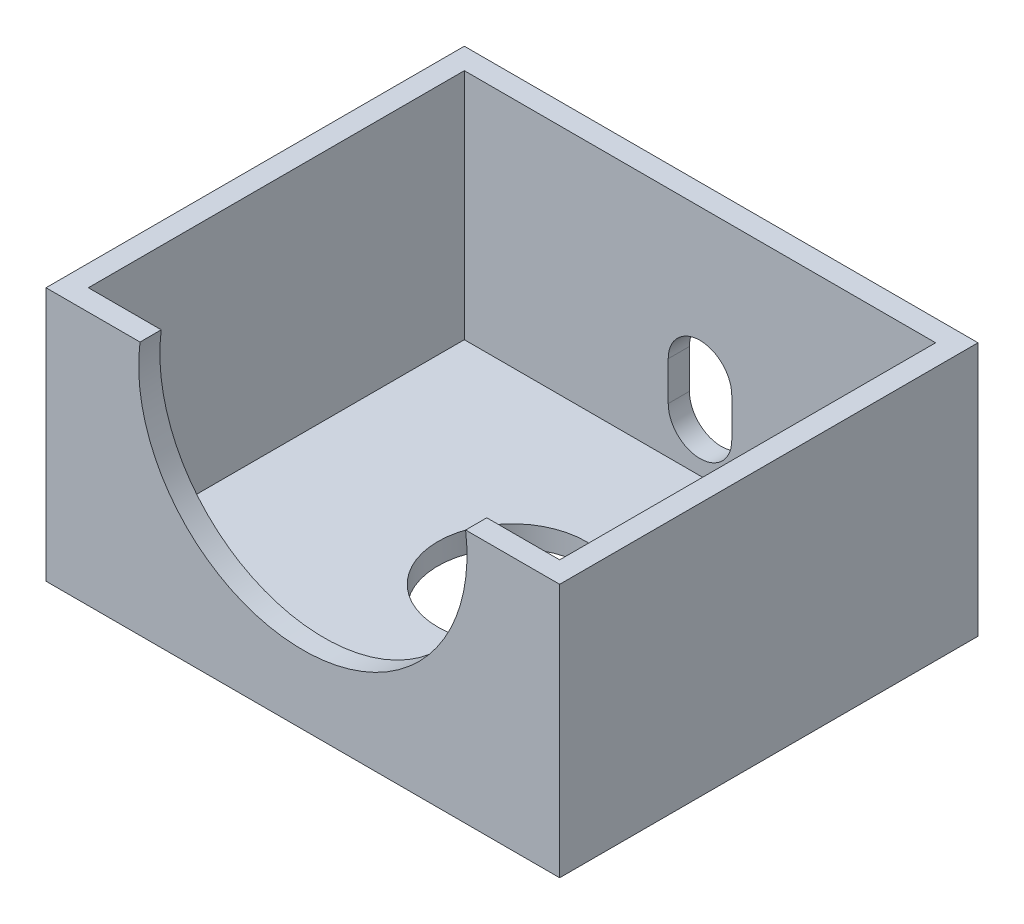
ISO-10303-21;
HEADER;
FILE_DESCRIPTION(('STEP AP214'),'2;1');
FILE_NAME('part.step','',(''),(''),'','','');
FILE_SCHEMA(('AUTOMOTIVE_DESIGN { 1 0 10303 214 1 1 1 1 }'));
ENDSEC;
DATA;
#1=APPLICATION_CONTEXT('core data for automotive mechanical design processes');
#2=APPLICATION_PROTOCOL_DEFINITION('international standard','automotive_design',2000,#1);
#3=PRODUCT_CONTEXT('',#1,'mechanical');
#4=PRODUCT('Part','Part','',(#3));
#5=PRODUCT_RELATED_PRODUCT_CATEGORY('part','',(#4));
#6=PRODUCT_DEFINITION_FORMATION('','',#4);
#7=PRODUCT_DEFINITION_CONTEXT('part definition',#1,'design');
#8=PRODUCT_DEFINITION('design','',#6,#7);
#9=PRODUCT_DEFINITION_SHAPE('','',#8);
#10=(LENGTH_UNIT() NAMED_UNIT(*) SI_UNIT(.MILLI.,.METRE.));
#11=(NAMED_UNIT(*) PLANE_ANGLE_UNIT() SI_UNIT($,.RADIAN.));
#12=(NAMED_UNIT(*) SI_UNIT($,.STERADIAN.) SOLID_ANGLE_UNIT());
#13=UNCERTAINTY_MEASURE_WITH_UNIT(LENGTH_MEASURE(1.E-05),#10,'distance_accuracy_value','');
#14=(GEOMETRIC_REPRESENTATION_CONTEXT(3) GLOBAL_UNCERTAINTY_ASSIGNED_CONTEXT((#13)) GLOBAL_UNIT_ASSIGNED_CONTEXT((#10,
#11,#12)) REPRESENTATION_CONTEXT('',''));
#15=CARTESIAN_POINT('',(0.,0.,0.));
#16=DIRECTION('',(0.,0.,1.));
#17=DIRECTION('',(1.,0.,0.));
#18=AXIS2_PLACEMENT_3D('',#15,#16,#17);
#19=CARTESIAN_POINT('',(24.25,2.,-19.75));
#20=DIRECTION('',(-1.,0.,0.));
#21=DIRECTION('',(0.,0.,1.));
#22=AXIS2_PLACEMENT_3D('',#19,#20,#21);
#23=PLANE('',#22);
#24=DIRECTION('',(0.,0.,-1.));
#25=VECTOR('',#24,1.);
#26=CARTESIAN_POINT('',(24.25,0.,-19.75));
#27=LINE('',#26,#25);
#28=CARTESIAN_POINT('',(24.25,0.,19.75));
#29=VERTEX_POINT('',#28);
#30=CARTESIAN_POINT('',(24.25,0.,-19.75));
#31=VERTEX_POINT('',#30);
#32=EDGE_CURVE('E248',#29,#31,#27,.T.);
#33=ORIENTED_EDGE('',*,*,#32,.T.);
#34=DIRECTION('',(0.,-1.,0.));
#35=VECTOR('',#34,1.);
#36=CARTESIAN_POINT('',(24.25,2.,-19.75));
#37=LINE('',#36,#35);
#38=CARTESIAN_POINT('',(24.25,24.,-19.75));
#39=VERTEX_POINT('',#38);
#40=EDGE_CURVE('E273',#39,#31,#37,.T.);
#41=ORIENTED_EDGE('',*,*,#40,.F.);
#42=DIRECTION('',(0.,0.,-1.));
#43=VECTOR('',#42,1.);
#44=CARTESIAN_POINT('',(24.25,24.,19.75));
#45=LINE('',#44,#43);
#46=CARTESIAN_POINT('',(24.25,24.,19.75));
#47=VERTEX_POINT('',#46);
#48=EDGE_CURVE('E236',#47,#39,#45,.T.);
#49=ORIENTED_EDGE('',*,*,#48,.F.);
#50=DIRECTION('',(0.,-1.,0.));
#51=VECTOR('',#50,1.);
#52=CARTESIAN_POINT('',(24.25,2.,19.75));
#53=LINE('',#52,#51);
#54=EDGE_CURVE('E261',#47,#29,#53,.T.);
#55=ORIENTED_EDGE('',*,*,#54,.T.);
#56=EDGE_LOOP('',(#33,#41,#49,#55));
#57=FACE_BOUND('',#56,.T.);
#58=ADVANCED_FACE('F43',(#57),#23,.F.);
#59=CARTESIAN_POINT('',(-24.25,2.,-19.75));
#60=DIRECTION('',(0.,0.,1.));
#61=DIRECTION('',(1.,0.,0.));
#62=AXIS2_PLACEMENT_3D('',#59,#60,#61);
#63=PLANE('',#62);
#64=DIRECTION('',(0.,-1.,0.));
#65=VECTOR('',#64,1.);
#66=CARTESIAN_POINT('',(3.,10.0708768884514,-19.75));
#67=LINE('',#66,#65);
#68=CARTESIAN_POINT('',(3.,10.0708768884514,-19.75));
#69=VERTEX_POINT('',#68);
#70=CARTESIAN_POINT('',(3.,6.40363295362596,-19.75));
#71=VERTEX_POINT('',#70);
#72=EDGE_CURVE('E157',#69,#71,#67,.T.);
#73=ORIENTED_EDGE('',*,*,#72,.F.);
#74=CARTESIAN_POINT('',(0.,10.0708768884514,-19.75));
#75=DIRECTION('',(0.,0.,-1.));
#76=DIRECTION('',(-1.,0.,0.));
#77=AXIS2_PLACEMENT_3D('',#74,#75,#76);
#78=CIRCLE('',#77,3.);
#79=CARTESIAN_POINT('',(-3.,10.0708768884514,-19.75));
#80=VERTEX_POINT('',#79);
#81=EDGE_CURVE('E59',#80,#69,#78,.T.);
#82=ORIENTED_EDGE('',*,*,#81,.F.);
#83=DIRECTION('',(0.,1.,0.));
#84=VECTOR('',#83,1.);
#85=CARTESIAN_POINT('',(-3.,10.0708768884514,-19.75));
#86=LINE('',#85,#84);
#87=CARTESIAN_POINT('',(-3.,6.40363295362596,-19.75));
#88=VERTEX_POINT('',#87);
#89=EDGE_CURVE('E165',#88,#80,#86,.T.);
#90=ORIENTED_EDGE('',*,*,#89,.F.);
#91=CARTESIAN_POINT('',(0.,6.40363295362596,-19.75));
#92=DIRECTION('',(0.,0.,-1.));
#93=DIRECTION('',(-1.,0.,0.));
#94=AXIS2_PLACEMENT_3D('',#91,#92,#93);
#95=CIRCLE('',#94,3.);
#96=EDGE_CURVE('E147',#71,#88,#95,.T.);
#97=ORIENTED_EDGE('',*,*,#96,.F.);
#98=EDGE_LOOP('',(#73,#82,#90,#97));
#99=FACE_BOUND('',#98,.T.);
#100=DIRECTION('',(-1.,0.,0.));
#101=VECTOR('',#100,1.);
#102=CARTESIAN_POINT('',(-24.25,0.,-19.75));
#103=LINE('',#102,#101);
#104=CARTESIAN_POINT('',(-24.25,0.,-19.75));
#105=VERTEX_POINT('',#104);
#106=EDGE_CURVE('E252',#31,#105,#103,.T.);
#107=ORIENTED_EDGE('',*,*,#106,.T.);
#108=DIRECTION('',(0.,-1.,0.));
#109=VECTOR('',#108,1.);
#110=CARTESIAN_POINT('',(-24.25,2.,-19.75));
#111=LINE('',#110,#109);
#112=CARTESIAN_POINT('',(-24.25,24.,-19.75));
#113=VERTEX_POINT('',#112);
#114=EDGE_CURVE('E269',#113,#105,#111,.T.);
#115=ORIENTED_EDGE('',*,*,#114,.F.);
#116=DIRECTION('',(-1.,0.,0.));
#117=VECTOR('',#116,1.);
#118=CARTESIAN_POINT('',(24.25,24.,-19.75));
#119=LINE('',#118,#117);
#120=EDGE_CURVE('E240',#39,#113,#119,.T.);
#121=ORIENTED_EDGE('',*,*,#120,.F.);
#122=ORIENTED_EDGE('',*,*,#40,.T.);
#123=EDGE_LOOP('',(#107,#115,#121,#122));
#124=FACE_BOUND('',#123,.T.);
#125=ADVANCED_FACE('F162',(#99,#124),#63,.F.);
#126=CARTESIAN_POINT('',(-24.25,2.,-19.75));
#127=DIRECTION('',(1.,0.,0.));
#128=DIRECTION('',(0.,0.,-1.));
#129=AXIS2_PLACEMENT_3D('',#126,#127,#128);
#130=PLANE('',#129);
#131=DIRECTION('',(0.,0.,1.));
#132=VECTOR('',#131,1.);
#133=CARTESIAN_POINT('',(-24.25,0.,-19.75));
#134=LINE('',#133,#132);
#135=CARTESIAN_POINT('',(-24.25,0.,19.75));
#136=VERTEX_POINT('',#135);
#137=EDGE_CURVE('E255',#105,#136,#134,.T.);
#138=ORIENTED_EDGE('',*,*,#137,.T.);
#139=DIRECTION('',(0.,-1.,0.));
#140=VECTOR('',#139,1.);
#141=CARTESIAN_POINT('',(-24.25,2.,19.75));
#142=LINE('',#141,#140);
#143=CARTESIAN_POINT('',(-24.25,24.,19.75));
#144=VERTEX_POINT('',#143);
#145=EDGE_CURVE('E265',#144,#136,#142,.T.);
#146=ORIENTED_EDGE('',*,*,#145,.F.);
#147=DIRECTION('',(0.,0.,1.));
#148=VECTOR('',#147,1.);
#149=CARTESIAN_POINT('',(-24.25,24.,-19.75));
#150=LINE('',#149,#148);
#151=EDGE_CURVE('E244',#113,#144,#150,.T.);
#152=ORIENTED_EDGE('',*,*,#151,.F.);
#153=ORIENTED_EDGE('',*,*,#114,.T.);
#154=EDGE_LOOP('',(#138,#146,#152,#153));
#155=FACE_BOUND('',#154,.T.);
#156=ADVANCED_FACE('F324',(#155),#130,.F.);
#157=CARTESIAN_POINT('',(-24.25,2.,19.75));
#158=DIRECTION('',(0.,0.,-1.));
#159=DIRECTION('',(-1.,0.,0.));
#160=AXIS2_PLACEMENT_3D('',#157,#158,#159);
#161=PLANE('',#160);
#162=DIRECTION('',(1.,0.,0.));
#163=VECTOR('',#162,1.);
#164=CARTESIAN_POINT('',(-24.25,24.,19.75));
#165=LINE('',#164,#163);
#166=CARTESIAN_POINT('',(15.3704261489394,24.,19.75));
#167=VERTEX_POINT('',#166);
#168=EDGE_CURVE('E231',#167,#47,#165,.T.);
#169=ORIENTED_EDGE('',*,*,#168,.F.);
#170=CARTESIAN_POINT('',(0.,22.,19.75));
#171=DIRECTION('',(0.,0.,1.));
#172=DIRECTION('',(1.,0.,0.));
#173=AXIS2_PLACEMENT_3D('',#170,#171,#172);
#174=CIRCLE('',#173,15.5);
#175=CARTESIAN_POINT('',(-15.3704261489394,24.,19.75));
#176=VERTEX_POINT('',#175);
#177=EDGE_CURVE('E175',#176,#167,#174,.T.);
#178=ORIENTED_EDGE('',*,*,#177,.F.);
#179=EDGE_CURVE('E232',#144,#176,#165,.T.);
#180=ORIENTED_EDGE('',*,*,#179,.F.);
#181=ORIENTED_EDGE('',*,*,#145,.T.);
#182=DIRECTION('',(1.,0.,0.));
#183=VECTOR('',#182,1.);
#184=CARTESIAN_POINT('',(-24.25,0.,19.75));
#185=LINE('',#184,#183);
#186=EDGE_CURVE('E258',#136,#29,#185,.T.);
#187=ORIENTED_EDGE('',*,*,#186,.T.);
#188=ORIENTED_EDGE('',*,*,#54,.F.);
#189=EDGE_LOOP('',(#169,#178,#180,#181,#187,#188));
#190=FACE_BOUND('',#189,.T.);
#191=ADVANCED_FACE('F310',(#190),#161,.F.);
#192=CARTESIAN_POINT('',(0.,0.,0.));
#193=DIRECTION('',(0.,1.,0.));
#194=DIRECTION('',(0.,0.,1.));
#195=AXIS2_PLACEMENT_3D('',#192,#193,#194);
#196=PLANE('',#195);
#197=CARTESIAN_POINT('',(0.,0.,0.));
#198=DIRECTION('',(0.,-1.,0.));
#199=DIRECTION('',(0.,0.,-1.));
#200=AXIS2_PLACEMENT_3D('',#197,#198,#199);
#201=CIRCLE('',#200,7.);
#202=CARTESIAN_POINT('',(0.,0.,-7.));
#203=VERTEX_POINT('',#202);
#204=EDGE_CURVE('E298',#203,#203,#201,.T.);
#205=ORIENTED_EDGE('',*,*,#204,.F.);
#206=EDGE_LOOP('',(#205));
#207=FACE_BOUND('',#206,.T.);
#208=ORIENTED_EDGE('',*,*,#32,.F.);
#209=ORIENTED_EDGE('',*,*,#186,.F.);
#210=ORIENTED_EDGE('',*,*,#137,.F.);
#211=ORIENTED_EDGE('',*,*,#106,.F.);
#212=EDGE_LOOP('',(#208,#209,#210,#211));
#213=FACE_BOUND('',#212,.T.);
#214=ADVANCED_FACE('F306',(#207,#213),#196,.F.);
#215=CARTESIAN_POINT('',(0.,24.,0.));
#216=DIRECTION('',(0.,1.,0.));
#217=DIRECTION('',(0.,0.,1.));
#218=AXIS2_PLACEMENT_3D('',#215,#216,#217);
#219=PLANE('',#218);
#220=DIRECTION('',(0.,0.,1.));
#221=VECTOR('',#220,1.);
#222=CARTESIAN_POINT('',(-15.3704261489394,24.,9.75));
#223=LINE('',#222,#221);
#224=CARTESIAN_POINT('',(-15.3704261489394,24.,17.75));
#225=VERTEX_POINT('',#224);
#226=EDGE_CURVE('E185',#225,#176,#223,.T.);
#227=ORIENTED_EDGE('',*,*,#226,.F.);
#228=DIRECTION('',(1.,0.,0.));
#229=VECTOR('',#228,1.);
#230=CARTESIAN_POINT('',(-22.25,24.,17.75));
#231=LINE('',#230,#229);
#232=CARTESIAN_POINT('',(-22.25,24.,17.75));
#233=VERTEX_POINT('',#232);
#234=EDGE_CURVE('E201',#233,#225,#231,.T.);
#235=ORIENTED_EDGE('',*,*,#234,.F.);
#236=DIRECTION('',(0.,0.,1.));
#237=VECTOR('',#236,1.);
#238=CARTESIAN_POINT('',(-22.25,24.,-17.75));
#239=LINE('',#238,#237);
#240=CARTESIAN_POINT('',(-22.25,24.,-17.75));
#241=VERTEX_POINT('',#240);
#242=EDGE_CURVE('E196',#241,#233,#239,.T.);
#243=ORIENTED_EDGE('',*,*,#242,.F.);
#244=DIRECTION('',(-1.,0.,0.));
#245=VECTOR('',#244,1.);
#246=CARTESIAN_POINT('',(-22.25,24.,-17.75));
#247=LINE('',#246,#245);
#248=CARTESIAN_POINT('',(22.25,24.,-17.75));
#249=VERTEX_POINT('',#248);
#250=EDGE_CURVE('E192',#249,#241,#247,.T.);
#251=ORIENTED_EDGE('',*,*,#250,.F.);
#252=DIRECTION('',(0.,0.,-1.));
#253=VECTOR('',#252,1.);
#254=CARTESIAN_POINT('',(22.25,24.,-17.75));
#255=LINE('',#254,#253);
#256=CARTESIAN_POINT('',(22.25,24.,17.75));
#257=VERTEX_POINT('',#256);
#258=EDGE_CURVE('E189',#257,#249,#255,.T.);
#259=ORIENTED_EDGE('',*,*,#258,.F.);
#260=CARTESIAN_POINT('',(15.3704261489394,24.,17.75));
#261=VERTEX_POINT('',#260);
#262=EDGE_CURVE('E200',#261,#257,#231,.T.);
#263=ORIENTED_EDGE('',*,*,#262,.F.);
#264=DIRECTION('',(0.,0.,1.));
#265=VECTOR('',#264,1.);
#266=CARTESIAN_POINT('',(15.3704261489394,24.,9.75));
#267=LINE('',#266,#265);
#268=EDGE_CURVE('E182',#167,#261,#267,.F.);
#269=ORIENTED_EDGE('',*,*,#268,.F.);
#270=ORIENTED_EDGE('',*,*,#168,.T.);
#271=ORIENTED_EDGE('',*,*,#48,.T.);
#272=ORIENTED_EDGE('',*,*,#120,.T.);
#273=ORIENTED_EDGE('',*,*,#151,.T.);
#274=ORIENTED_EDGE('',*,*,#179,.T.);
#275=EDGE_LOOP('',(#227,#235,#243,#251,#259,#263,#269,#270,#271,#272,#273,#274));
#276=FACE_BOUND('',#275,.T.);
#277=ADVANCED_FACE('F309',(#276),#219,.T.);
#278=CARTESIAN_POINT('',(22.25,24.,-17.75));
#279=DIRECTION('',(-1.,0.,0.));
#280=DIRECTION('',(0.,0.,1.));
#281=AXIS2_PLACEMENT_3D('',#278,#279,#280);
#282=PLANE('',#281);
#283=DIRECTION('',(0.,0.,-1.));
#284=VECTOR('',#283,1.);
#285=CARTESIAN_POINT('',(22.25,2.,-17.75));
#286=LINE('',#285,#284);
#287=CARTESIAN_POINT('',(22.25,2.,17.75));
#288=VERTEX_POINT('',#287);
#289=CARTESIAN_POINT('',(22.25,2.,-17.75));
#290=VERTEX_POINT('',#289);
#291=EDGE_CURVE('E188',#288,#290,#286,.T.);
#292=ORIENTED_EDGE('',*,*,#291,.F.);
#293=DIRECTION('',(0.,-1.,0.));
#294=VECTOR('',#293,1.);
#295=CARTESIAN_POINT('',(22.25,24.,17.75));
#296=LINE('',#295,#294);
#297=EDGE_CURVE('E205',#257,#288,#296,.T.);
#298=ORIENTED_EDGE('',*,*,#297,.F.);
#299=ORIENTED_EDGE('',*,*,#258,.T.);
#300=DIRECTION('',(0.,-1.,0.));
#301=VECTOR('',#300,1.);
#302=CARTESIAN_POINT('',(22.25,24.,-17.75));
#303=LINE('',#302,#301);
#304=EDGE_CURVE('E227',#249,#290,#303,.T.);
#305=ORIENTED_EDGE('',*,*,#304,.T.);
#306=EDGE_LOOP('',(#292,#298,#299,#305));
#307=FACE_BOUND('',#306,.T.);
#308=ADVANCED_FACE('F345',(#307),#282,.T.);
#309=CARTESIAN_POINT('',(-22.25,24.,-17.75));
#310=DIRECTION('',(0.,0.,1.));
#311=DIRECTION('',(1.,0.,0.));
#312=AXIS2_PLACEMENT_3D('',#309,#310,#311);
#313=PLANE('',#312);
#314=CARTESIAN_POINT('',(0.,10.0708768884514,-17.75));
#315=DIRECTION('',(0.,0.,1.));
#316=DIRECTION('',(1.,0.,0.));
#317=AXIS2_PLACEMENT_3D('',#314,#315,#316);
#318=CIRCLE('',#317,3.);
#319=CARTESIAN_POINT('',(3.,10.0708768884514,-17.75));
#320=VERTEX_POINT('',#319);
#321=CARTESIAN_POINT('',(-3.,10.0708768884514,-17.75));
#322=VERTEX_POINT('',#321);
#323=EDGE_CURVE('E11',#320,#322,#318,.T.);
#324=ORIENTED_EDGE('',*,*,#323,.F.);
#325=DIRECTION('',(0.,1.,0.));
#326=VECTOR('',#325,1.);
#327=CARTESIAN_POINT('',(3.,24.,-17.75));
#328=LINE('',#327,#326);
#329=CARTESIAN_POINT('',(3.,6.40363295362596,-17.75));
#330=VERTEX_POINT('',#329);
#331=EDGE_CURVE('E280',#330,#320,#328,.T.);
#332=ORIENTED_EDGE('',*,*,#331,.F.);
#333=CARTESIAN_POINT('',(0.,6.40363295362596,-17.75));
#334=DIRECTION('',(0.,0.,1.));
#335=DIRECTION('',(1.,0.,0.));
#336=AXIS2_PLACEMENT_3D('',#333,#334,#335);
#337=CIRCLE('',#336,3.);
#338=CARTESIAN_POINT('',(-3.,6.40363295362596,-17.75));
#339=VERTEX_POINT('',#338);
#340=EDGE_CURVE('E150',#339,#330,#337,.T.);
#341=ORIENTED_EDGE('',*,*,#340,.F.);
#342=DIRECTION('',(0.,-1.,0.));
#343=VECTOR('',#342,1.);
#344=CARTESIAN_POINT('',(-3.,24.,-17.75));
#345=LINE('',#344,#343);
#346=EDGE_CURVE('E52',#322,#339,#345,.T.);
#347=ORIENTED_EDGE('',*,*,#346,.F.);
#348=EDGE_LOOP('',(#324,#332,#341,#347));
#349=FACE_BOUND('',#348,.T.);
#350=DIRECTION('',(-1.,0.,0.));
#351=VECTOR('',#350,1.);
#352=CARTESIAN_POINT('',(-22.25,2.,-17.75));
#353=LINE('',#352,#351);
#354=CARTESIAN_POINT('',(-22.25,2.,-17.75));
#355=VERTEX_POINT('',#354);
#356=EDGE_CURVE('E208',#290,#355,#353,.T.);
#357=ORIENTED_EDGE('',*,*,#356,.F.);
#358=ORIENTED_EDGE('',*,*,#304,.F.);
#359=ORIENTED_EDGE('',*,*,#250,.T.);
#360=DIRECTION('',(0.,-1.,0.));
#361=VECTOR('',#360,1.);
#362=CARTESIAN_POINT('',(-22.25,24.,-17.75));
#363=LINE('',#362,#361);
#364=EDGE_CURVE('E223',#241,#355,#363,.T.);
#365=ORIENTED_EDGE('',*,*,#364,.T.);
#366=EDGE_LOOP('',(#357,#358,#359,#365));
#367=FACE_BOUND('',#366,.T.);
#368=ADVANCED_FACE('F292',(#349,#367),#313,.T.);
#369=CARTESIAN_POINT('',(-22.25,24.,-17.75));
#370=DIRECTION('',(1.,0.,0.));
#371=DIRECTION('',(0.,0.,-1.));
#372=AXIS2_PLACEMENT_3D('',#369,#370,#371);
#373=PLANE('',#372);
#374=DIRECTION('',(0.,0.,1.));
#375=VECTOR('',#374,1.);
#376=CARTESIAN_POINT('',(-22.25,2.,-17.75));
#377=LINE('',#376,#375);
#378=CARTESIAN_POINT('',(-22.25,2.,17.75));
#379=VERTEX_POINT('',#378);
#380=EDGE_CURVE('E211',#355,#379,#377,.T.);
#381=ORIENTED_EDGE('',*,*,#380,.F.);
#382=ORIENTED_EDGE('',*,*,#364,.F.);
#383=ORIENTED_EDGE('',*,*,#242,.T.);
#384=DIRECTION('',(0.,-1.,0.));
#385=VECTOR('',#384,1.);
#386=CARTESIAN_POINT('',(-22.25,24.,17.75));
#387=LINE('',#386,#385);
#388=EDGE_CURVE('E219',#233,#379,#387,.T.);
#389=ORIENTED_EDGE('',*,*,#388,.T.);
#390=EDGE_LOOP('',(#381,#382,#383,#389));
#391=FACE_BOUND('',#390,.T.);
#392=ADVANCED_FACE('F351',(#391),#373,.T.);
#393=CARTESIAN_POINT('',(-22.25,24.,17.75));
#394=DIRECTION('',(0.,0.,-1.));
#395=DIRECTION('',(-1.,0.,0.));
#396=AXIS2_PLACEMENT_3D('',#393,#394,#395);
#397=PLANE('',#396);
#398=CARTESIAN_POINT('',(0.,22.,17.75));
#399=DIRECTION('',(0.,0.,-1.));
#400=DIRECTION('',(-1.,0.,0.));
#401=AXIS2_PLACEMENT_3D('',#398,#399,#400);
#402=CIRCLE('',#401,15.5);
#403=EDGE_CURVE('E277',#261,#225,#402,.T.);
#404=ORIENTED_EDGE('',*,*,#403,.F.);
#405=ORIENTED_EDGE('',*,*,#262,.T.);
#406=ORIENTED_EDGE('',*,*,#297,.T.);
#407=DIRECTION('',(1.,0.,0.));
#408=VECTOR('',#407,1.);
#409=CARTESIAN_POINT('',(-22.25,2.,17.75));
#410=LINE('',#409,#408);
#411=EDGE_CURVE('E193',#379,#288,#410,.T.);
#412=ORIENTED_EDGE('',*,*,#411,.F.);
#413=ORIENTED_EDGE('',*,*,#388,.F.);
#414=ORIENTED_EDGE('',*,*,#234,.T.);
#415=EDGE_LOOP('',(#404,#405,#406,#412,#413,#414));
#416=FACE_BOUND('',#415,.T.);
#417=ADVANCED_FACE('F341',(#416),#397,.T.);
#418=CARTESIAN_POINT('',(0.,2.,0.));
#419=DIRECTION('',(0.,1.,0.));
#420=DIRECTION('',(0.,0.,1.));
#421=AXIS2_PLACEMENT_3D('',#418,#419,#420);
#422=PLANE('',#421);
#423=CARTESIAN_POINT('',(0.,2.,0.));
#424=DIRECTION('',(0.,1.,0.));
#425=DIRECTION('',(0.,0.,1.));
#426=AXIS2_PLACEMENT_3D('',#423,#424,#425);
#427=CIRCLE('',#426,7.);
#428=CARTESIAN_POINT('',(0.,2.,7.));
#429=VERTEX_POINT('',#428);
#430=EDGE_CURVE('E46',#429,#429,#427,.T.);
#431=ORIENTED_EDGE('',*,*,#430,.F.);
#432=EDGE_LOOP('',(#431));
#433=FACE_BOUND('',#432,.T.);
#434=ORIENTED_EDGE('',*,*,#291,.T.);
#435=ORIENTED_EDGE('',*,*,#356,.T.);
#436=ORIENTED_EDGE('',*,*,#380,.T.);
#437=ORIENTED_EDGE('',*,*,#411,.T.);
#438=EDGE_LOOP('',(#434,#435,#436,#437));
#439=FACE_BOUND('',#438,.T.);
#440=ADVANCED_FACE('F337',(#433,#439),#422,.T.);
#441=CARTESIAN_POINT('',(0.,22.,9.75));
#442=DIRECTION('',(0.,0.,1.));
#443=DIRECTION('',(1.,0.,0.));
#444=AXIS2_PLACEMENT_3D('',#441,#442,#443);
#445=CYLINDRICAL_SURFACE('',#444,15.5);
#446=ORIENTED_EDGE('',*,*,#226,.T.);
#447=ORIENTED_EDGE('',*,*,#177,.T.);
#448=ORIENTED_EDGE('',*,*,#268,.T.);
#449=ORIENTED_EDGE('',*,*,#403,.T.);
#450=EDGE_LOOP('',(#446,#447,#448,#449));
#451=FACE_BOUND('',#450,.T.);
#452=ADVANCED_FACE('F340',(#451),#445,.F.);
#453=CARTESIAN_POINT('',(0.,10.0708768884514,-9.75));
#454=DIRECTION('',(0.,0.,-1.));
#455=DIRECTION('',(-1.,0.,0.));
#456=AXIS2_PLACEMENT_3D('',#453,#454,#455);
#457=CYLINDRICAL_SURFACE('',#456,3.);
#458=ORIENTED_EDGE('',*,*,#323,.T.);
#459=DIRECTION('',(0.,0.,-1.));
#460=VECTOR('',#459,1.);
#461=CARTESIAN_POINT('',(-3.,10.0708768884514,-9.75));
#462=LINE('',#461,#460);
#463=EDGE_CURVE('E172',#322,#80,#462,.T.);
#464=ORIENTED_EDGE('',*,*,#463,.T.);
#465=ORIENTED_EDGE('',*,*,#81,.T.);
#466=DIRECTION('',(0.,0.,-1.));
#467=VECTOR('',#466,1.);
#468=CARTESIAN_POINT('',(3.,10.0708768884514,-9.75));
#469=LINE('',#468,#467);
#470=EDGE_CURVE('E154',#320,#69,#469,.T.);
#471=ORIENTED_EDGE('',*,*,#470,.F.);
#472=EDGE_LOOP('',(#458,#464,#465,#471));
#473=FACE_BOUND('',#472,.T.);
#474=ADVANCED_FACE('F294',(#473),#457,.F.);
#475=CARTESIAN_POINT('',(-3.,10.0708768884514,-9.75));
#476=DIRECTION('',(-1.,0.,0.));
#477=DIRECTION('',(0.,0.,1.));
#478=AXIS2_PLACEMENT_3D('',#475,#476,#477);
#479=PLANE('',#478);
#480=ORIENTED_EDGE('',*,*,#346,.T.);
#481=DIRECTION('',(0.,0.,-1.));
#482=VECTOR('',#481,1.);
#483=CARTESIAN_POINT('',(-3.,6.40363295362596,-9.75));
#484=LINE('',#483,#482);
#485=EDGE_CURVE('E153',#339,#88,#484,.T.);
#486=ORIENTED_EDGE('',*,*,#485,.T.);
#487=ORIENTED_EDGE('',*,*,#89,.T.);
#488=ORIENTED_EDGE('',*,*,#463,.F.);
#489=EDGE_LOOP('',(#480,#486,#487,#488));
#490=FACE_BOUND('',#489,.T.);
#491=ADVANCED_FACE('F289',(#490),#479,.F.);
#492=CARTESIAN_POINT('',(0.,6.40363295362596,-9.75));
#493=DIRECTION('',(0.,0.,-1.));
#494=DIRECTION('',(-1.,0.,0.));
#495=AXIS2_PLACEMENT_3D('',#492,#493,#494);
#496=CYLINDRICAL_SURFACE('',#495,3.);
#497=ORIENTED_EDGE('',*,*,#340,.T.);
#498=DIRECTION('',(0.,0.,-1.));
#499=VECTOR('',#498,1.);
#500=CARTESIAN_POINT('',(3.,6.40363295362596,-9.75));
#501=LINE('',#500,#499);
#502=EDGE_CURVE('E67',#330,#71,#501,.T.);
#503=ORIENTED_EDGE('',*,*,#502,.T.);
#504=ORIENTED_EDGE('',*,*,#96,.T.);
#505=ORIENTED_EDGE('',*,*,#485,.F.);
#506=EDGE_LOOP('',(#497,#503,#504,#505));
#507=FACE_BOUND('',#506,.T.);
#508=ADVANCED_FACE('F144',(#507),#496,.F.);
#509=CARTESIAN_POINT('',(3.,10.0708768884514,-9.75));
#510=DIRECTION('',(1.,0.,0.));
#511=DIRECTION('',(0.,0.,-1.));
#512=AXIS2_PLACEMENT_3D('',#509,#510,#511);
#513=PLANE('',#512);
#514=ORIENTED_EDGE('',*,*,#331,.T.);
#515=ORIENTED_EDGE('',*,*,#470,.T.);
#516=ORIENTED_EDGE('',*,*,#72,.T.);
#517=ORIENTED_EDGE('',*,*,#502,.F.);
#518=EDGE_LOOP('',(#514,#515,#516,#517));
#519=FACE_BOUND('',#518,.T.);
#520=ADVANCED_FACE('F158',(#519),#513,.F.);
#521=CARTESIAN_POINT('',(0.,10.,0.));
#522=DIRECTION('',(0.,-1.,0.));
#523=DIRECTION('',(0.,0.,-1.));
#524=AXIS2_PLACEMENT_3D('',#521,#522,#523);
#525=CYLINDRICAL_SURFACE('',#524,7.);
#526=ORIENTED_EDGE('',*,*,#430,.T.);
#527=EDGE_LOOP('',(#526));
#528=FACE_BOUND('',#527,.T.);
#529=ORIENTED_EDGE('',*,*,#204,.T.);
#530=EDGE_LOOP('',(#529));
#531=FACE_BOUND('',#530,.T.);
#532=ADVANCED_FACE('F304',(#528,#531),#525,.F.);
#533=CLOSED_SHELL('',(#58,#125,#156,#191,#214,#277,#308,#368,#392,#417,#440,#452,#474,#491,#508,
#520,#532));
#534=MANIFOLD_SOLID_BREP('B2',#533);
#535=ADVANCED_BREP_SHAPE_REPRESENTATION('',(#18,#534),#14);
#536=SHAPE_DEFINITION_REPRESENTATION(#9,#535);
ENDSEC;
END-ISO-10303-21;
